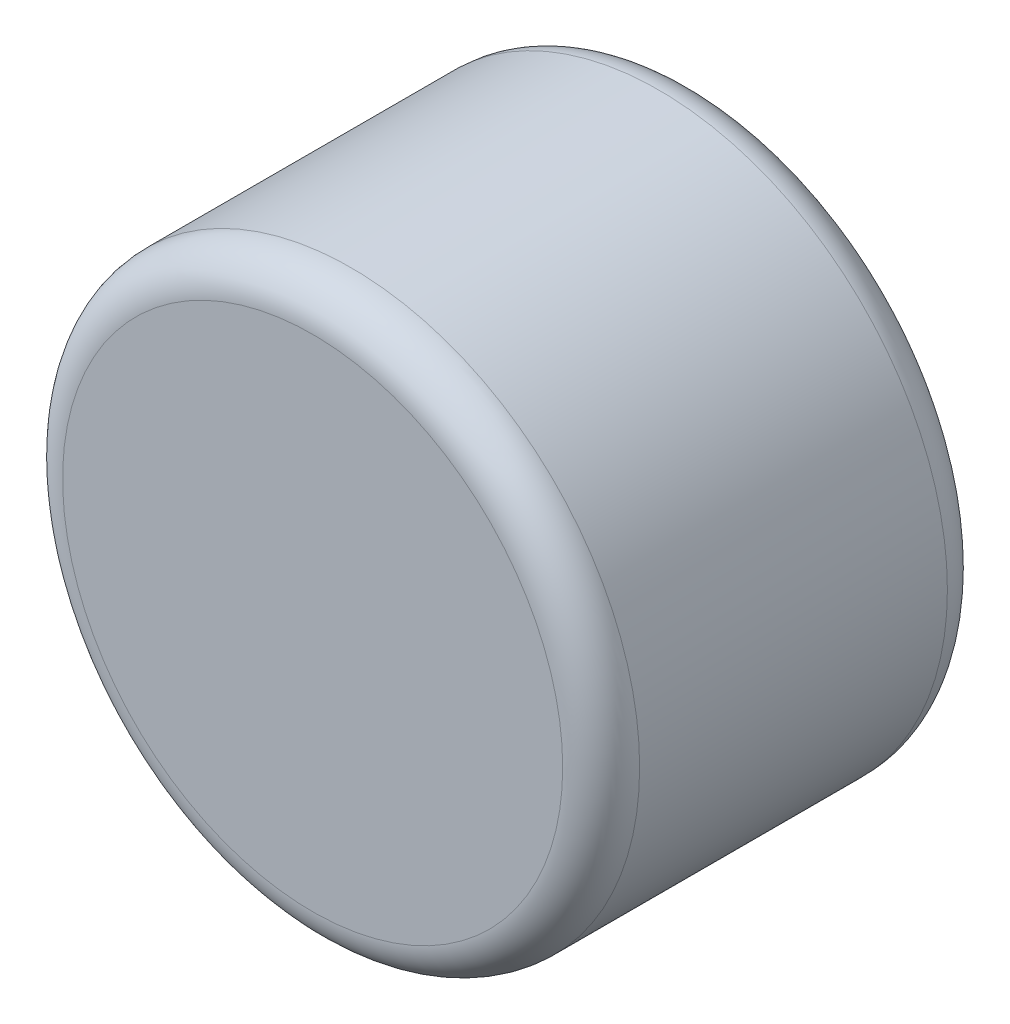
ISO-10303-21;
HEADER;
FILE_DESCRIPTION(('STEP AP214'),'2;1');
FILE_NAME('part.step','',(''),(''),'','','');
FILE_SCHEMA(('AUTOMOTIVE_DESIGN { 1 0 10303 214 1 1 1 1 }'));
ENDSEC;
DATA;
#1=APPLICATION_CONTEXT('core data for automotive mechanical design processes');
#2=APPLICATION_PROTOCOL_DEFINITION('international standard','automotive_design',2000,#1);
#3=PRODUCT_CONTEXT('',#1,'mechanical');
#4=PRODUCT('Part','Part','',(#3));
#5=PRODUCT_RELATED_PRODUCT_CATEGORY('part','',(#4));
#6=PRODUCT_DEFINITION_FORMATION('','',#4);
#7=PRODUCT_DEFINITION_CONTEXT('part definition',#1,'design');
#8=PRODUCT_DEFINITION('design','',#6,#7);
#9=PRODUCT_DEFINITION_SHAPE('','',#8);
#10=(LENGTH_UNIT() NAMED_UNIT(*) SI_UNIT(.MILLI.,.METRE.));
#11=(NAMED_UNIT(*) PLANE_ANGLE_UNIT() SI_UNIT($,.RADIAN.));
#12=(NAMED_UNIT(*) SI_UNIT($,.STERADIAN.) SOLID_ANGLE_UNIT());
#13=UNCERTAINTY_MEASURE_WITH_UNIT(LENGTH_MEASURE(1.E-05),#10,'distance_accuracy_value','');
#14=(GEOMETRIC_REPRESENTATION_CONTEXT(3) GLOBAL_UNCERTAINTY_ASSIGNED_CONTEXT((#13)) GLOBAL_UNIT_ASSIGNED_CONTEXT((#10,
#11,#12)) REPRESENTATION_CONTEXT('',''));
#15=CARTESIAN_POINT('',(0.,0.,0.));
#16=DIRECTION('',(0.,0.,1.));
#17=DIRECTION('',(1.,0.,0.));
#18=AXIS2_PLACEMENT_3D('',#15,#16,#17);
#19=CARTESIAN_POINT('',(0.,0.,2.));
#20=DIRECTION('',(0.,0.,-1.));
#21=DIRECTION('',(-1.,0.,0.));
#22=AXIS2_PLACEMENT_3D('',#19,#20,#21);
#23=CYLINDRICAL_SURFACE('',#22,1.5);
#24=CARTESIAN_POINT('',(0.,0.,0.2));
#25=DIRECTION('',(0.,0.,1.));
#26=DIRECTION('',(1.,0.,0.));
#27=AXIS2_PLACEMENT_3D('',#24,#25,#26);
#28=CIRCLE('',#27,1.5);
#29=CARTESIAN_POINT('',(1.5,0.,0.2));
#30=VERTEX_POINT('',#29);
#31=EDGE_CURVE('E44',#30,#30,#28,.T.);
#32=ORIENTED_EDGE('',*,*,#31,.T.);
#33=EDGE_LOOP('',(#32));
#34=FACE_BOUND('',#33,.T.);
#35=CARTESIAN_POINT('',(0.,0.,1.8));
#36=DIRECTION('',(0.,0.,1.));
#37=DIRECTION('',(1.,0.,0.));
#38=AXIS2_PLACEMENT_3D('',#35,#36,#37);
#39=CIRCLE('',#38,1.5);
#40=CARTESIAN_POINT('',(1.5,0.,1.8));
#41=VERTEX_POINT('',#40);
#42=EDGE_CURVE('E48',#41,#41,#39,.F.);
#43=ORIENTED_EDGE('',*,*,#42,.T.);
#44=EDGE_LOOP('',(#43));
#45=FACE_BOUND('',#44,.T.);
#46=ADVANCED_FACE('F33',(#34,#45),#23,.T.);
#47=CARTESIAN_POINT('',(0.,0.,2.));
#48=DIRECTION('',(0.,0.,1.));
#49=DIRECTION('',(1.,0.,0.));
#50=AXIS2_PLACEMENT_3D('',#47,#48,#49);
#51=PLANE('',#50);
#52=CARTESIAN_POINT('',(0.,0.,2.));
#53=DIRECTION('',(0.,0.,1.));
#54=DIRECTION('',(1.,0.,0.));
#55=AXIS2_PLACEMENT_3D('',#52,#53,#54);
#56=CIRCLE('',#55,1.3);
#57=CARTESIAN_POINT('',(1.3,0.,2.));
#58=VERTEX_POINT('',#57);
#59=EDGE_CURVE('E10',#58,#58,#56,.T.);
#60=ORIENTED_EDGE('',*,*,#59,.T.);
#61=EDGE_LOOP('',(#60));
#62=FACE_BOUND('',#61,.T.);
#63=ADVANCED_FACE('F64',(#62),#51,.T.);
#64=CARTESIAN_POINT('',(0.,0.,0.));
#65=DIRECTION('',(0.,0.,1.));
#66=DIRECTION('',(1.,0.,0.));
#67=AXIS2_PLACEMENT_3D('',#64,#65,#66);
#68=PLANE('',#67);
#69=CARTESIAN_POINT('',(0.,0.,0.));
#70=DIRECTION('',(0.,0.,1.));
#71=DIRECTION('',(1.,0.,0.));
#72=AXIS2_PLACEMENT_3D('',#69,#70,#71);
#73=CIRCLE('',#72,1.3);
#74=CARTESIAN_POINT('',(1.3,0.,0.));
#75=VERTEX_POINT('',#74);
#76=EDGE_CURVE('E40',#75,#75,#73,.F.);
#77=ORIENTED_EDGE('',*,*,#76,.T.);
#78=EDGE_LOOP('',(#77));
#79=FACE_BOUND('',#78,.T.);
#80=ADVANCED_FACE('F61',(#79),#68,.F.);
#81=CARTESIAN_POINT('',(0.,0.,0.2));
#82=DIRECTION('',(0.,0.,1.));
#83=DIRECTION('',(1.,0.,0.));
#84=AXIS2_PLACEMENT_3D('',#81,#82,#83);
#85=TOROIDAL_SURFACE('',#84,1.3,0.2);
#86=ORIENTED_EDGE('',*,*,#76,.F.);
#87=EDGE_LOOP('',(#86));
#88=FACE_BOUND('',#87,.T.);
#89=ORIENTED_EDGE('',*,*,#31,.F.);
#90=EDGE_LOOP('',(#89));
#91=FACE_BOUND('',#90,.T.);
#92=ADVANCED_FACE('F57',(#88,#91),#85,.T.);
#93=CARTESIAN_POINT('',(0.,0.,1.8));
#94=DIRECTION('',(0.,0.,1.));
#95=DIRECTION('',(1.,0.,0.));
#96=AXIS2_PLACEMENT_3D('',#93,#94,#95);
#97=TOROIDAL_SURFACE('',#96,1.3,0.2);
#98=ORIENTED_EDGE('',*,*,#42,.F.);
#99=EDGE_LOOP('',(#98));
#100=FACE_BOUND('',#99,.T.);
#101=ORIENTED_EDGE('',*,*,#59,.F.);
#102=EDGE_LOOP('',(#101));
#103=FACE_BOUND('',#102,.T.);
#104=ADVANCED_FACE('F35',(#100,#103),#97,.T.);
#105=CLOSED_SHELL('',(#46,#63,#80,#92,#104));
#106=MANIFOLD_SOLID_BREP('B2',#105);
#107=ADVANCED_BREP_SHAPE_REPRESENTATION('',(#18,#106),#14);
#108=SHAPE_DEFINITION_REPRESENTATION(#9,#107);
ENDSEC;
END-ISO-10303-21;
